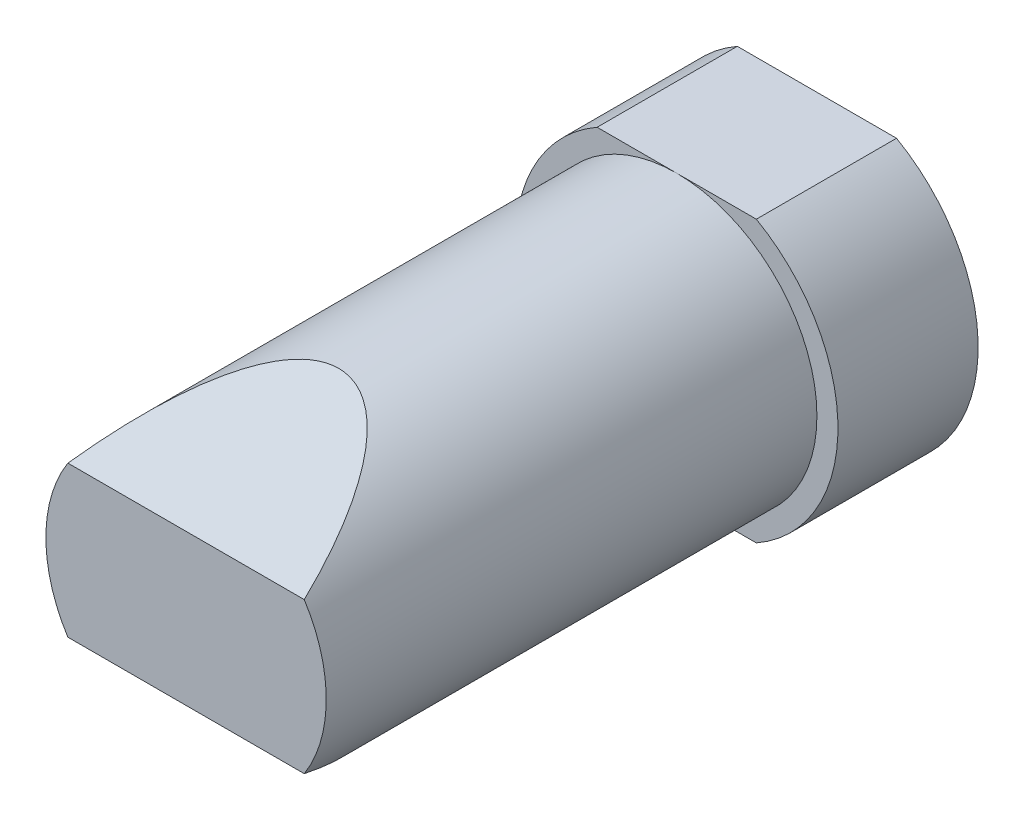
ISO-10303-21;
HEADER;
FILE_DESCRIPTION(('STEP AP214'),'2;1');
FILE_NAME('part.step','',(''),(''),'','','');
FILE_SCHEMA(('AUTOMOTIVE_DESIGN { 1 0 10303 214 1 1 1 1 }'));
ENDSEC;
DATA;
#1=APPLICATION_CONTEXT('core data for automotive mechanical design processes');
#2=APPLICATION_PROTOCOL_DEFINITION('international standard','automotive_design',2000,#1);
#3=PRODUCT_CONTEXT('',#1,'mechanical');
#4=PRODUCT('Part','Part','',(#3));
#5=PRODUCT_RELATED_PRODUCT_CATEGORY('part','',(#4));
#6=PRODUCT_DEFINITION_FORMATION('','',#4);
#7=PRODUCT_DEFINITION_CONTEXT('part definition',#1,'design');
#8=PRODUCT_DEFINITION('design','',#6,#7);
#9=PRODUCT_DEFINITION_SHAPE('','',#8);
#10=(LENGTH_UNIT() NAMED_UNIT(*) SI_UNIT(.MILLI.,.METRE.));
#11=(NAMED_UNIT(*) PLANE_ANGLE_UNIT() SI_UNIT($,.RADIAN.));
#12=(NAMED_UNIT(*) SI_UNIT($,.STERADIAN.) SOLID_ANGLE_UNIT());
#13=UNCERTAINTY_MEASURE_WITH_UNIT(LENGTH_MEASURE(1.E-05),#10,'distance_accuracy_value','');
#14=(GEOMETRIC_REPRESENTATION_CONTEXT(3) GLOBAL_UNCERTAINTY_ASSIGNED_CONTEXT((#13)) GLOBAL_UNIT_ASSIGNED_CONTEXT((#10,
#11,#12)) REPRESENTATION_CONTEXT('',''));
#15=CARTESIAN_POINT('',(0.,0.,0.));
#16=DIRECTION('',(0.,0.,1.));
#17=DIRECTION('',(1.,0.,0.));
#18=AXIS2_PLACEMENT_3D('',#15,#16,#17);
#19=CARTESIAN_POINT('',(0.,0.,-5.83333333003111));
#20=DIRECTION('',(0.,0.,-1.));
#21=DIRECTION('',(-1.,0.,0.));
#22=AXIS2_PLACEMENT_3D('',#19,#20,#21);
#23=CONICAL_SURFACE('',#22,0.800000000026557,1.04719755119509);
#24=CARTESIAN_POINT('',(0.,0.,-5.83333333));
#25=DIRECTION('',(0.,0.,1.));
#26=DIRECTION('',(1.,0.,0.));
#27=AXIS2_PLACEMENT_3D('',#24,#25,#26);
#28=CIRCLE('',#27,0.8);
#29=CARTESIAN_POINT('',(0.8,0.,-5.83333333));
#30=VERTEX_POINT('',#29);
#31=EDGE_CURVE('E128',#30,#30,#28,.F.);
#32=ORIENTED_EDGE('',*,*,#31,.T.);
#33=EDGE_LOOP('',(#32));
#34=FACE_BOUND('',#33,.T.);
#35=CARTESIAN_POINT('',(0.,0.,-5.37145311466247));
#36=VERTEX_POINT('',#35);
#37=VERTEX_LOOP('',#36);
#38=FACE_BOUND('',#37,.T.);
#39=ADVANCED_FACE('F15',(#34,#38),#23,.F.);
#40=CARTESIAN_POINT('',(0.,0.,-6.166666665));
#41=DIRECTION('',(0.,0.,1.));
#42=DIRECTION('',(1.,0.,0.));
#43=AXIS2_PLACEMENT_3D('',#40,#41,#42);
#44=CYLINDRICAL_SURFACE('',#43,0.8);
#45=ORIENTED_EDGE('',*,*,#31,.F.);
#46=EDGE_LOOP('',(#45));
#47=FACE_BOUND('',#46,.T.);
#48=CARTESIAN_POINT('',(0.,0.,-6.5));
#49=DIRECTION('',(0.,0.,1.));
#50=DIRECTION('',(1.,0.,0.));
#51=AXIS2_PLACEMENT_3D('',#48,#49,#50);
#52=CIRCLE('',#51,0.8);
#53=CARTESIAN_POINT('',(0.8,0.,-6.5));
#54=VERTEX_POINT('',#53);
#55=EDGE_CURVE('E18',#54,#54,#52,.T.);
#56=ORIENTED_EDGE('',*,*,#55,.F.);
#57=EDGE_LOOP('',(#56));
#58=FACE_BOUND('',#57,.T.);
#59=ADVANCED_FACE('F324',(#47,#58),#44,.F.);
#60=CARTESIAN_POINT('',(0.,0.8975,-6.5));
#61=DIRECTION('',(0.,0.,1.));
#62=DIRECTION('',(1.,0.,0.));
#63=AXIS2_PLACEMENT_3D('',#60,#61,#62);
#64=PLANE('',#63);
#65=ORIENTED_EDGE('',*,*,#55,.T.);
#66=EDGE_LOOP('',(#65));
#67=FACE_BOUND('',#66,.T.);
#68=CARTESIAN_POINT('',(0.,0.,-6.5));
#69=DIRECTION('',(0.,0.,1.));
#70=DIRECTION('',(1.,0.,0.));
#71=AXIS2_PLACEMENT_3D('',#68,#69,#70);
#72=CIRCLE('',#71,0.795);
#73=CARTESIAN_POINT('',(0.795,0.,-6.5));
#74=VERTEX_POINT('',#73);
#75=EDGE_CURVE('E120',#74,#74,#72,.F.);
#76=ORIENTED_EDGE('',*,*,#75,.T.);
#77=EDGE_LOOP('',(#76));
#78=FACE_BOUND('',#77,.T.);
#79=ADVANCED_FACE('F314',(#67,#78),#64,.T.);
#80=CARTESIAN_POINT('',(0.,0.,-9.3975));
#81=DIRECTION('',(0.,0.,1.));
#82=DIRECTION('',(1.,0.,0.));
#83=AXIS2_PLACEMENT_3D('',#80,#81,#82);
#84=CYLINDRICAL_SURFACE('',#83,0.795);
#85=CARTESIAN_POINT('',(0.,0.,-12.2949999999946));
#86=DIRECTION('',(0.,0.,-1.));
#87=DIRECTION('',(0.,1.,0.));
#88=AXIS2_PLACEMENT_3D('',#85,#86,#87);
#89=CIRCLE('',#88,0.795000000039181);
#90=CARTESIAN_POINT('',(0.,0.795000000039181,-12.2949999999946));
#91=VERTEX_POINT('',#90);
#92=EDGE_CURVE('E122',#91,#91,#89,.T.);
#93=ORIENTED_EDGE('',*,*,#92,.T.);
#94=EDGE_LOOP('',(#93));
#95=FACE_BOUND('',#94,.T.);
#96=ORIENTED_EDGE('',*,*,#75,.F.);
#97=EDGE_LOOP('',(#96));
#98=FACE_BOUND('',#97,.T.);
#99=ADVANCED_FACE('F304',(#95,#98),#84,.F.);
#100=CARTESIAN_POINT('',(0.,0.,-12.4999999999318));
#101=DIRECTION('',(0.,0.,-1.));
#102=DIRECTION('',(-1.,0.,0.));
#103=AXIS2_PLACEMENT_3D('',#100,#101,#102);
#104=CONICAL_SURFACE('',#103,0.999999999976353,0.785398163258806);
#105=CARTESIAN_POINT('',(0.,0.,-12.4999999999886));
#106=DIRECTION('',(0.,0.,-1.));
#107=DIRECTION('',(-1.,0.,0.));
#108=AXIS2_PLACEMENT_3D('',#105,#106,#107);
#109=CIRCLE('',#108,1.0000000000332);
#110=CARTESIAN_POINT('',(-1.0000000000332,0.,-12.4999999999886));
#111=VERTEX_POINT('',#110);
#112=EDGE_CURVE('E118',#111,#111,#109,.F.);
#113=ORIENTED_EDGE('',*,*,#112,.F.);
#114=EDGE_LOOP('',(#113));
#115=FACE_BOUND('',#114,.T.);
#116=ORIENTED_EDGE('',*,*,#92,.F.);
#117=EDGE_LOOP('',(#116));
#118=FACE_BOUND('',#117,.T.);
#119=ADVANCED_FACE('F188',(#115,#118),#104,.F.);
#120=CARTESIAN_POINT('',(0.,0.,-11.5));
#121=DIRECTION('',(0.,0.,-1.));
#122=DIRECTION('',(-1.,0.,0.));
#123=AXIS2_PLACEMENT_3D('',#120,#121,#122);
#124=CYLINDRICAL_SURFACE('',#123,2.3);
#125=DIRECTION('',(0.,0.,1.));
#126=VECTOR('',#125,1.);
#127=CARTESIAN_POINT('',(-1.13578166916005,2.,-11.5));
#128=LINE('',#127,#126);
#129=CARTESIAN_POINT('',(-1.13578166916005,2.,-12.5));
#130=VERTEX_POINT('',#129);
#131=CARTESIAN_POINT('',(-1.13578166916005,2.,-10.5));
#132=VERTEX_POINT('',#131);
#133=EDGE_CURVE('E151',#130,#132,#128,.T.);
#134=ORIENTED_EDGE('',*,*,#133,.F.);
#135=CARTESIAN_POINT('',(0.,0.,-12.5));
#136=DIRECTION('',(0.,0.,-1.));
#137=DIRECTION('',(-1.,0.,0.));
#138=AXIS2_PLACEMENT_3D('',#135,#136,#137);
#139=CIRCLE('',#138,2.3);
#140=CARTESIAN_POINT('',(-1.13578166916005,-2.,-12.5));
#141=VERTEX_POINT('',#140);
#142=EDGE_CURVE('E114',#141,#130,#139,.T.);
#143=ORIENTED_EDGE('',*,*,#142,.F.);
#144=DIRECTION('',(0.,0.,-1.));
#145=VECTOR('',#144,1.);
#146=CARTESIAN_POINT('',(-1.13578166916005,-2.,-11.5));
#147=LINE('',#146,#145);
#148=CARTESIAN_POINT('',(-1.13578166916005,-2.,-10.5));
#149=VERTEX_POINT('',#148);
#150=EDGE_CURVE('E57',#149,#141,#147,.T.);
#151=ORIENTED_EDGE('',*,*,#150,.F.);
#152=CARTESIAN_POINT('',(0.,0.,-10.5));
#153=DIRECTION('',(0.,0.,-1.));
#154=DIRECTION('',(-1.,0.,0.));
#155=AXIS2_PLACEMENT_3D('',#152,#153,#154);
#156=CIRCLE('',#155,2.3);
#157=EDGE_CURVE('E110',#132,#149,#156,.F.);
#158=ORIENTED_EDGE('',*,*,#157,.F.);
#159=EDGE_LOOP('',(#134,#143,#151,#158));
#160=FACE_BOUND('',#159,.T.);
#161=ADVANCED_FACE('F165',(#160),#124,.T.);
#162=CARTESIAN_POINT('',(0.,-2.,-11.5));
#163=DIRECTION('',(0.,-1.,0.));
#164=DIRECTION('',(0.,0.,-1.));
#165=AXIS2_PLACEMENT_3D('',#162,#163,#164);
#166=PLANE('',#165);
#167=DIRECTION('',(1.,0.,0.));
#168=VECTOR('',#167,1.);
#169=CARTESIAN_POINT('',(0.,-2.,-10.5));
#170=LINE('',#169,#168);
#171=CARTESIAN_POINT('',(1.13578166916005,-2.,-10.5));
#172=VERTEX_POINT('',#171);
#173=CARTESIAN_POINT('',(0.,-2.,-10.5));
#174=VERTEX_POINT('',#173);
#175=EDGE_CURVE('E33',#172,#174,#170,.F.);
#176=ORIENTED_EDGE('',*,*,#175,.T.);
#177=DIRECTION('',(1.,0.,0.));
#178=VECTOR('',#177,1.);
#179=CARTESIAN_POINT('',(0.,-2.,-10.5));
#180=LINE('',#179,#178);
#181=EDGE_CURVE('E147',#149,#174,#180,.T.);
#182=ORIENTED_EDGE('',*,*,#181,.F.);
#183=ORIENTED_EDGE('',*,*,#150,.T.);
#184=DIRECTION('',(-1.,0.,0.));
#185=VECTOR('',#184,1.);
#186=CARTESIAN_POINT('',(0.,-2.,-12.5));
#187=LINE('',#186,#185);
#188=CARTESIAN_POINT('',(1.13578166916005,-2.,-12.5));
#189=VERTEX_POINT('',#188);
#190=EDGE_CURVE('E117',#189,#141,#187,.T.);
#191=ORIENTED_EDGE('',*,*,#190,.F.);
#192=DIRECTION('',(0.,0.,-1.));
#193=VECTOR('',#192,1.);
#194=CARTESIAN_POINT('',(1.13578166916005,-2.,-11.5));
#195=LINE('',#194,#193);
#196=EDGE_CURVE('E109',#172,#189,#195,.T.);
#197=ORIENTED_EDGE('',*,*,#196,.F.);
#198=EDGE_LOOP('',(#176,#182,#183,#191,#197));
#199=FACE_BOUND('',#198,.T.);
#200=ADVANCED_FACE('F179',(#199),#166,.T.);
#201=CARTESIAN_POINT('',(0.,0.,-12.5));
#202=DIRECTION('',(0.,0.,-1.));
#203=DIRECTION('',(-1.,0.,0.));
#204=AXIS2_PLACEMENT_3D('',#201,#202,#203);
#205=PLANE('',#204);
#206=DIRECTION('',(1.,0.,0.));
#207=VECTOR('',#206,1.);
#208=CARTESIAN_POINT('',(0.,2.,-12.5));
#209=LINE('',#208,#207);
#210=CARTESIAN_POINT('',(1.13578166916005,2.,-12.5));
#211=VERTEX_POINT('',#210);
#212=EDGE_CURVE('E116',#211,#130,#209,.F.);
#213=ORIENTED_EDGE('',*,*,#212,.F.);
#214=CARTESIAN_POINT('',(0.,0.,-12.5));
#215=DIRECTION('',(0.,0.,-1.));
#216=DIRECTION('',(-1.,0.,0.));
#217=AXIS2_PLACEMENT_3D('',#214,#215,#216);
#218=CIRCLE('',#217,2.3);
#219=EDGE_CURVE('E105',#189,#211,#218,.F.);
#220=ORIENTED_EDGE('',*,*,#219,.F.);
#221=ORIENTED_EDGE('',*,*,#190,.T.);
#222=ORIENTED_EDGE('',*,*,#142,.T.);
#223=EDGE_LOOP('',(#213,#220,#221,#222));
#224=FACE_BOUND('',#223,.T.);
#225=ORIENTED_EDGE('',*,*,#112,.T.);
#226=EDGE_LOOP('',(#225));
#227=FACE_BOUND('',#226,.T.);
#228=ADVANCED_FACE('F177',(#224,#227),#205,.T.);
#229=CARTESIAN_POINT('',(0.,2.,-11.5));
#230=DIRECTION('',(0.,1.,0.));
#231=DIRECTION('',(0.,0.,1.));
#232=AXIS2_PLACEMENT_3D('',#229,#230,#231);
#233=PLANE('',#232);
#234=DIRECTION('',(1.,0.,0.));
#235=VECTOR('',#234,1.);
#236=CARTESIAN_POINT('',(0.,2.,-10.5));
#237=LINE('',#236,#235);
#238=CARTESIAN_POINT('',(0.,2.,-10.5));
#239=VERTEX_POINT('',#238);
#240=EDGE_CURVE('E113',#239,#132,#237,.F.);
#241=ORIENTED_EDGE('',*,*,#240,.F.);
#242=DIRECTION('',(1.,0.,0.));
#243=VECTOR('',#242,1.);
#244=CARTESIAN_POINT('',(0.,2.,-10.5));
#245=LINE('',#244,#243);
#246=CARTESIAN_POINT('',(1.13578166916005,2.,-10.5));
#247=VERTEX_POINT('',#246);
#248=EDGE_CURVE('E149',#239,#247,#245,.T.);
#249=ORIENTED_EDGE('',*,*,#248,.T.);
#250=DIRECTION('',(0.,0.,-1.));
#251=VECTOR('',#250,1.);
#252=CARTESIAN_POINT('',(1.13578166916005,2.,-11.5));
#253=LINE('',#252,#251);
#254=EDGE_CURVE('E108',#211,#247,#253,.F.);
#255=ORIENTED_EDGE('',*,*,#254,.F.);
#256=ORIENTED_EDGE('',*,*,#212,.T.);
#257=ORIENTED_EDGE('',*,*,#133,.T.);
#258=EDGE_LOOP('',(#241,#249,#255,#256,#257));
#259=FACE_BOUND('',#258,.T.);
#260=ADVANCED_FACE('F161',(#259),#233,.T.);
#261=CARTESIAN_POINT('',(0.,0.,-10.5));
#262=DIRECTION('',(0.,0.,1.));
#263=DIRECTION('',(1.,0.,0.));
#264=AXIS2_PLACEMENT_3D('',#261,#262,#263);
#265=PLANE('',#264);
#266=ORIENTED_EDGE('',*,*,#240,.T.);
#267=ORIENTED_EDGE('',*,*,#157,.T.);
#268=ORIENTED_EDGE('',*,*,#181,.T.);
#269=CARTESIAN_POINT('',(0.,0.,-10.5));
#270=DIRECTION('',(0.,0.,-1.));
#271=DIRECTION('',(-1.,0.,0.));
#272=AXIS2_PLACEMENT_3D('',#269,#270,#271);
#273=CIRCLE('',#272,2.);
#274=EDGE_CURVE('E91',#239,#174,#273,.F.);
#275=ORIENTED_EDGE('',*,*,#274,.F.);
#276=EDGE_LOOP('',(#266,#267,#268,#275));
#277=FACE_BOUND('',#276,.T.);
#278=ADVANCED_FACE('F167',(#277),#265,.T.);
#279=CARTESIAN_POINT('',(0.,0.,-11.5));
#280=DIRECTION('',(0.,0.,-1.));
#281=DIRECTION('',(-1.,0.,0.));
#282=AXIS2_PLACEMENT_3D('',#279,#280,#281);
#283=CYLINDRICAL_SURFACE('',#282,2.3);
#284=ORIENTED_EDGE('',*,*,#254,.T.);
#285=CARTESIAN_POINT('',(0.,0.,-10.5));
#286=DIRECTION('',(0.,0.,-1.));
#287=DIRECTION('',(-1.,0.,0.));
#288=AXIS2_PLACEMENT_3D('',#285,#286,#287);
#289=CIRCLE('',#288,2.3);
#290=EDGE_CURVE('E96',#172,#247,#289,.F.);
#291=ORIENTED_EDGE('',*,*,#290,.F.);
#292=ORIENTED_EDGE('',*,*,#196,.T.);
#293=ORIENTED_EDGE('',*,*,#219,.T.);
#294=EDGE_LOOP('',(#284,#291,#292,#293));
#295=FACE_BOUND('',#294,.T.);
#296=ADVANCED_FACE('F174',(#295),#283,.T.);
#297=CARTESIAN_POINT('',(0.,1.5,-4.5));
#298=DIRECTION('',(0.,0.92050485345244,0.390731128489274));
#299=DIRECTION('',(0.,-0.390731128489274,0.92050485345244));
#300=AXIS2_PLACEMENT_3D('',#297,#298,#299);
#301=PLANE('',#300);
#302=DIRECTION('',(1.,0.,0.));
#303=VECTOR('',#302,1.);
#304=CARTESIAN_POINT('',(0.,1.07552518379039,-3.5));
#305=LINE('',#304,#303);
#306=CARTESIAN_POINT('',(1.68619262809225,1.07552518379039,-3.5));
#307=VERTEX_POINT('',#306);
#308=CARTESIAN_POINT('',(-1.68619262809225,1.07552518379039,-3.5));
#309=VERTEX_POINT('',#308);
#310=EDGE_CURVE('E92',#307,#309,#305,.F.);
#311=ORIENTED_EDGE('',*,*,#310,.F.);
#312=CARTESIAN_POINT('',(0.,0.,-0.966221451264374));
#313=DIRECTION('',(0.,0.92050485345244,0.390731128489274));
#314=DIRECTION('',(0.,0.390731128489274,-0.92050485345244));
#315=AXIS2_PLACEMENT_3D('',#312,#313,#314);
#316=ELLIPSE('',#315,5.1186093304949,2.);
#317=EDGE_CURVE('E99',#309,#307,#316,.F.);
#318=ORIENTED_EDGE('',*,*,#317,.F.);
#319=EDGE_LOOP('',(#311,#318));
#320=FACE_BOUND('',#319,.T.);
#321=ADVANCED_FACE('F138',(#320),#301,.T.);
#322=CARTESIAN_POINT('',(0.,0.,-3.5));
#323=DIRECTION('',(0.,0.,1.));
#324=DIRECTION('',(1.,0.,0.));
#325=AXIS2_PLACEMENT_3D('',#322,#323,#324);
#326=PLANE('',#325);
#327=ORIENTED_EDGE('',*,*,#310,.T.);
#328=CARTESIAN_POINT('',(0.,0.,-3.5));
#329=DIRECTION('',(0.,0.,-1.));
#330=DIRECTION('',(-1.,0.,0.));
#331=AXIS2_PLACEMENT_3D('',#328,#329,#330);
#332=CIRCLE('',#331,2.);
#333=CARTESIAN_POINT('',(-1.68619262809225,-1.07552518379039,-3.5));
#334=VERTEX_POINT('',#333);
#335=EDGE_CURVE('E83',#334,#309,#332,.T.);
#336=ORIENTED_EDGE('',*,*,#335,.F.);
#337=DIRECTION('',(1.,0.,0.));
#338=VECTOR('',#337,1.);
#339=CARTESIAN_POINT('',(0.,-1.07552518379039,-3.5));
#340=LINE('',#339,#338);
#341=CARTESIAN_POINT('',(1.68619262809225,-1.07552518379039,-3.5));
#342=VERTEX_POINT('',#341);
#343=EDGE_CURVE('E88',#342,#334,#340,.F.);
#344=ORIENTED_EDGE('',*,*,#343,.F.);
#345=CARTESIAN_POINT('',(0.,0.,-3.5));
#346=DIRECTION('',(0.,0.,-1.));
#347=DIRECTION('',(-1.,0.,0.));
#348=AXIS2_PLACEMENT_3D('',#345,#346,#347);
#349=CIRCLE('',#348,2.);
#350=EDGE_CURVE('E85',#307,#342,#349,.T.);
#351=ORIENTED_EDGE('',*,*,#350,.F.);
#352=EDGE_LOOP('',(#327,#336,#344,#351));
#353=FACE_BOUND('',#352,.T.);
#354=ADVANCED_FACE('F95',(#353),#326,.T.);
#355=CARTESIAN_POINT('',(0.,-1.5,-4.5));
#356=DIRECTION('',(0.,-0.92050485345244,0.390731128489274));
#357=DIRECTION('',(0.,-0.390731128489274,-0.92050485345244));
#358=AXIS2_PLACEMENT_3D('',#355,#356,#357);
#359=PLANE('',#358);
#360=ORIENTED_EDGE('',*,*,#343,.T.);
#361=CARTESIAN_POINT('',(0.,0.,-0.966221451264374));
#362=DIRECTION('',(0.,-0.92050485345244,0.390731128489274));
#363=DIRECTION('',(0.,-0.390731128489274,-0.92050485345244));
#364=AXIS2_PLACEMENT_3D('',#361,#362,#363);
#365=ELLIPSE('',#364,5.1186093304949,2.);
#366=EDGE_CURVE('E24',#342,#334,#365,.F.);
#367=ORIENTED_EDGE('',*,*,#366,.F.);
#368=EDGE_LOOP('',(#360,#367));
#369=FACE_BOUND('',#368,.T.);
#370=ADVANCED_FACE('F89',(#369),#359,.T.);
#371=CARTESIAN_POINT('',(0.,0.,-10.5));
#372=DIRECTION('',(0.,0.,1.));
#373=DIRECTION('',(1.,0.,0.));
#374=AXIS2_PLACEMENT_3D('',#371,#372,#373);
#375=PLANE('',#374);
#376=ORIENTED_EDGE('',*,*,#248,.F.);
#377=CARTESIAN_POINT('',(0.,0.,-10.5));
#378=DIRECTION('',(0.,0.,-1.));
#379=DIRECTION('',(-1.,0.,0.));
#380=AXIS2_PLACEMENT_3D('',#377,#378,#379);
#381=CIRCLE('',#380,2.);
#382=EDGE_CURVE('E10',#174,#239,#381,.F.);
#383=ORIENTED_EDGE('',*,*,#382,.F.);
#384=ORIENTED_EDGE('',*,*,#175,.F.);
#385=ORIENTED_EDGE('',*,*,#290,.T.);
#386=EDGE_LOOP('',(#376,#383,#384,#385));
#387=FACE_BOUND('',#386,.T.);
#388=ADVANCED_FACE('F171',(#387),#375,.T.);
#389=CARTESIAN_POINT('',(0.,0.,-7.));
#390=DIRECTION('',(0.,0.,-1.));
#391=DIRECTION('',(-1.,0.,0.));
#392=AXIS2_PLACEMENT_3D('',#389,#390,#391);
#393=CYLINDRICAL_SURFACE('',#392,2.);
#394=ORIENTED_EDGE('',*,*,#335,.T.);
#395=ORIENTED_EDGE('',*,*,#317,.T.);
#396=ORIENTED_EDGE('',*,*,#350,.T.);
#397=ORIENTED_EDGE('',*,*,#366,.T.);
#398=EDGE_LOOP('',(#394,#395,#396,#397));
#399=FACE_BOUND('',#398,.T.);
#400=ORIENTED_EDGE('',*,*,#382,.T.);
#401=ORIENTED_EDGE('',*,*,#274,.T.);
#402=EDGE_LOOP('',(#400,#401));
#403=FACE_BOUND('',#402,.T.);
#404=ADVANCED_FACE('F79',(#399,#403),#393,.T.);
#405=CLOSED_SHELL('',(#39,#59,#79,#99,#119,#161,#200,#228,#260,#278,#296,#321,#354,#370,#388,#404));
#406=MANIFOLD_SOLID_BREP('B1',#405);
#407=ADVANCED_BREP_SHAPE_REPRESENTATION('',(#18,#406),#14);
#408=SHAPE_DEFINITION_REPRESENTATION(#9,#407);
ENDSEC;
END-ISO-10303-21;
